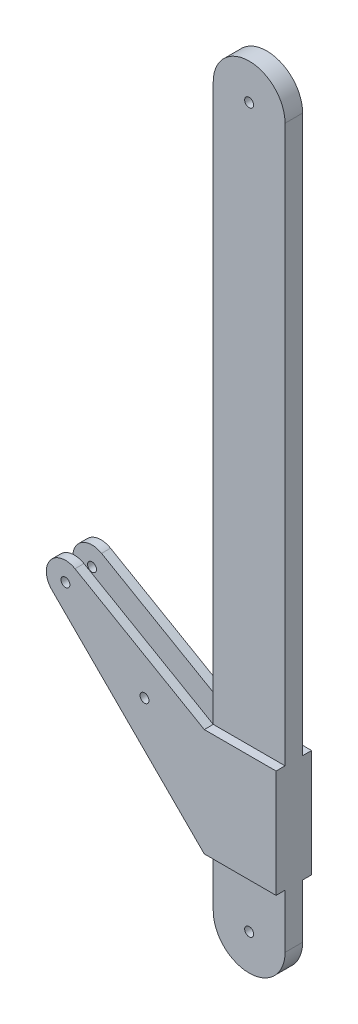
ISO-10303-21;
HEADER;
FILE_DESCRIPTION(('STEP AP214'),'2;1');
FILE_NAME('part.step','',(''),(''),'','','');
FILE_SCHEMA(('AUTOMOTIVE_DESIGN { 1 0 10303 214 1 1 1 1 }'));
ENDSEC;
DATA;
#1=APPLICATION_CONTEXT('core data for automotive mechanical design processes');
#2=APPLICATION_PROTOCOL_DEFINITION('international standard','automotive_design',2000,#1);
#3=PRODUCT_CONTEXT('',#1,'mechanical');
#4=PRODUCT('Part','Part','',(#3));
#5=PRODUCT_RELATED_PRODUCT_CATEGORY('part','',(#4));
#6=PRODUCT_DEFINITION_FORMATION('','',#4);
#7=PRODUCT_DEFINITION_CONTEXT('part definition',#1,'design');
#8=PRODUCT_DEFINITION('design','',#6,#7);
#9=PRODUCT_DEFINITION_SHAPE('','',#8);
#10=(LENGTH_UNIT() NAMED_UNIT(*) SI_UNIT(.MILLI.,.METRE.));
#11=(NAMED_UNIT(*) PLANE_ANGLE_UNIT() SI_UNIT($,.RADIAN.));
#12=(NAMED_UNIT(*) SI_UNIT($,.STERADIAN.) SOLID_ANGLE_UNIT());
#13=UNCERTAINTY_MEASURE_WITH_UNIT(LENGTH_MEASURE(1.E-05),#10,'distance_accuracy_value','');
#14=(GEOMETRIC_REPRESENTATION_CONTEXT(3) GLOBAL_UNCERTAINTY_ASSIGNED_CONTEXT((#13)) GLOBAL_UNIT_ASSIGNED_CONTEXT((#10,
#11,#12)) REPRESENTATION_CONTEXT('',''));
#15=CARTESIAN_POINT('',(0.,0.,0.));
#16=DIRECTION('',(0.,0.,1.));
#17=DIRECTION('',(1.,0.,0.));
#18=AXIS2_PLACEMENT_3D('',#15,#16,#17);
#19=CARTESIAN_POINT('',(0.,0.,-2.45));
#20=DIRECTION('',(0.,0.,1.));
#21=DIRECTION('',(1.,0.,0.));
#22=AXIS2_PLACEMENT_3D('',#19,#20,#21);
#23=PLANE('',#22);
#24=CARTESIAN_POINT('',(0.,-100.,-2.45));
#25=DIRECTION('',(0.,0.,1.));
#26=DIRECTION('',(1.,0.,0.));
#27=AXIS2_PLACEMENT_3D('',#24,#25,#26);
#28=CIRCLE('',#27,1.25);
#29=CARTESIAN_POINT('',(1.25000000000003,-100.,-2.45));
#30=VERTEX_POINT('',#29);
#31=EDGE_CURVE('E283',#30,#30,#28,.T.);
#32=ORIENTED_EDGE('',*,*,#31,.T.);
#33=EDGE_LOOP('',(#32));
#34=FACE_BOUND('',#33,.T.);
#35=DIRECTION('',(0.,1.,0.));
#36=VECTOR('',#35,1.);
#37=CARTESIAN_POINT('',(-9.99999999999999,0.,-2.45));
#38=LINE('',#37,#36);
#39=CARTESIAN_POINT('',(-9.99999999999999,-100.,-2.45));
#40=VERTEX_POINT('',#39);
#41=CARTESIAN_POINT('',(-9.99999999999999,-85.0000000000001,-2.45));
#42=VERTEX_POINT('',#41);
#43=EDGE_CURVE('E287',#40,#42,#38,.T.);
#44=ORIENTED_EDGE('',*,*,#43,.T.);
#45=DIRECTION('',(1.,0.,0.));
#46=VECTOR('',#45,1.);
#47=CARTESIAN_POINT('',(10.,-85.0000000000001,-2.45));
#48=LINE('',#47,#46);
#49=CARTESIAN_POINT('',(10.,-85.0000000000001,-2.45));
#50=VERTEX_POINT('',#49);
#51=EDGE_CURVE('E154',#42,#50,#48,.T.);
#52=ORIENTED_EDGE('',*,*,#51,.T.);
#53=DIRECTION('',(0.,1.,0.));
#54=VECTOR('',#53,1.);
#55=CARTESIAN_POINT('',(10.,0.,-2.45));
#56=LINE('',#55,#54);
#57=CARTESIAN_POINT('',(10.,-100.,-2.45));
#58=VERTEX_POINT('',#57);
#59=EDGE_CURVE('E295',#58,#50,#56,.T.);
#60=ORIENTED_EDGE('',*,*,#59,.F.);
#61=CARTESIAN_POINT('',(0.,-100.,-2.45));
#62=DIRECTION('',(0.,0.,1.));
#63=DIRECTION('',(1.,0.,0.));
#64=AXIS2_PLACEMENT_3D('',#61,#62,#63);
#65=CIRCLE('',#64,10.);
#66=EDGE_CURVE('E290',#40,#58,#65,.T.);
#67=ORIENTED_EDGE('',*,*,#66,.F.);
#68=EDGE_LOOP('',(#44,#52,#60,#67));
#69=FACE_BOUND('',#68,.T.);
#70=ADVANCED_FACE('F35',(#34,#69),#23,.F.);
#71=CARTESIAN_POINT('',(0.,0.,2.45));
#72=DIRECTION('',(0.,0.,1.));
#73=DIRECTION('',(1.,0.,0.));
#74=AXIS2_PLACEMENT_3D('',#71,#72,#73);
#75=PLANE('',#74);
#76=DIRECTION('',(1.,0.,0.));
#77=VECTOR('',#76,1.);
#78=CARTESIAN_POINT('',(10.,-85.0000000000001,2.45));
#79=LINE('',#78,#77);
#80=CARTESIAN_POINT('',(-9.99999999999999,-85.0000000000001,2.45));
#81=VERTEX_POINT('',#80);
#82=CARTESIAN_POINT('',(10.,-85.0000000000001,2.45));
#83=VERTEX_POINT('',#82);
#84=EDGE_CURVE('E214',#81,#83,#79,.T.);
#85=ORIENTED_EDGE('',*,*,#84,.F.);
#86=DIRECTION('',(0.,1.,0.));
#87=VECTOR('',#86,1.);
#88=CARTESIAN_POINT('',(-9.99999999999999,0.,2.45));
#89=LINE('',#88,#87);
#90=CARTESIAN_POINT('',(-9.99999999999999,-100.,2.45));
#91=VERTEX_POINT('',#90);
#92=EDGE_CURVE('E267',#91,#81,#89,.T.);
#93=ORIENTED_EDGE('',*,*,#92,.F.);
#94=CARTESIAN_POINT('',(0.,-100.,2.45));
#95=DIRECTION('',(0.,0.,1.));
#96=DIRECTION('',(1.,0.,0.));
#97=AXIS2_PLACEMENT_3D('',#94,#95,#96);
#98=CIRCLE('',#97,10.);
#99=CARTESIAN_POINT('',(10.,-100.,2.45));
#100=VERTEX_POINT('',#99);
#101=EDGE_CURVE('E270',#91,#100,#98,.T.);
#102=ORIENTED_EDGE('',*,*,#101,.T.);
#103=DIRECTION('',(0.,1.,0.));
#104=VECTOR('',#103,1.);
#105=CARTESIAN_POINT('',(10.,0.,2.45));
#106=LINE('',#105,#104);
#107=EDGE_CURVE('E275',#100,#83,#106,.T.);
#108=ORIENTED_EDGE('',*,*,#107,.T.);
#109=EDGE_LOOP('',(#85,#93,#102,#108));
#110=FACE_BOUND('',#109,.T.);
#111=CARTESIAN_POINT('',(0.,-100.,2.45));
#112=DIRECTION('',(0.,0.,1.));
#113=DIRECTION('',(1.,0.,0.));
#114=AXIS2_PLACEMENT_3D('',#111,#112,#113);
#115=CIRCLE('',#114,1.25);
#116=CARTESIAN_POINT('',(1.25000000000003,-100.,2.45));
#117=VERTEX_POINT('',#116);
#118=EDGE_CURVE('E262',#117,#117,#115,.T.);
#119=ORIENTED_EDGE('',*,*,#118,.F.);
#120=EDGE_LOOP('',(#119));
#121=FACE_BOUND('',#120,.T.);
#122=ADVANCED_FACE('F356',(#110,#121),#75,.T.);
#123=CARTESIAN_POINT('',(-9.99999999999999,0.,2.45));
#124=DIRECTION('',(-1.,0.,0.));
#125=DIRECTION('',(0.,-1.,0.));
#126=AXIS2_PLACEMENT_3D('',#123,#124,#125);
#127=PLANE('',#126);
#128=ORIENTED_EDGE('',*,*,#43,.F.);
#129=DIRECTION('',(0.,0.,-1.));
#130=VECTOR('',#129,1.);
#131=CARTESIAN_POINT('',(-9.99999999999999,-100.,2.45));
#132=LINE('',#131,#130);
#133=EDGE_CURVE('E11',#91,#40,#132,.T.);
#134=ORIENTED_EDGE('',*,*,#133,.F.);
#135=ORIENTED_EDGE('',*,*,#92,.T.);
#136=CARTESIAN_POINT('',(-9.99999999999999,-55.0000000000001,2.45));
#137=VERTEX_POINT('',#136);
#138=EDGE_CURVE('E271',#81,#137,#89,.T.);
#139=ORIENTED_EDGE('',*,*,#138,.T.);
#140=CARTESIAN_POINT('',(-9.99999999999999,99.9999999999999,2.45));
#141=VERTEX_POINT('',#140);
#142=EDGE_CURVE('E266',#137,#141,#89,.T.);
#143=ORIENTED_EDGE('',*,*,#142,.T.);
#144=DIRECTION('',(0.,0.,-1.));
#145=VECTOR('',#144,1.);
#146=CARTESIAN_POINT('',(-9.99999999999999,99.9999999999999,2.45));
#147=LINE('',#146,#145);
#148=CARTESIAN_POINT('',(-9.99999999999999,99.9999999999999,-2.45));
#149=VERTEX_POINT('',#148);
#150=EDGE_CURVE('E280',#141,#149,#147,.T.);
#151=ORIENTED_EDGE('',*,*,#150,.T.);
#152=CARTESIAN_POINT('',(-9.99999999999999,-55.0000000000001,-2.45));
#153=VERTEX_POINT('',#152);
#154=EDGE_CURVE('E286',#153,#149,#38,.T.);
#155=ORIENTED_EDGE('',*,*,#154,.F.);
#156=EDGE_CURVE('E291',#42,#153,#38,.T.);
#157=ORIENTED_EDGE('',*,*,#156,.F.);
#158=EDGE_LOOP('',(#128,#134,#135,#139,#143,#151,#155,#157));
#159=FACE_BOUND('',#158,.T.);
#160=ADVANCED_FACE('F316',(#159),#127,.T.);
#161=CARTESIAN_POINT('',(0.,-100.,2.45));
#162=DIRECTION('',(0.,0.,-1.));
#163=DIRECTION('',(-1.,0.,0.));
#164=AXIS2_PLACEMENT_3D('',#161,#162,#163);
#165=CYLINDRICAL_SURFACE('',#164,10.);
#166=ORIENTED_EDGE('',*,*,#66,.T.);
#167=DIRECTION('',(0.,0.,-1.));
#168=VECTOR('',#167,1.);
#169=CARTESIAN_POINT('',(10.,-100.,2.45));
#170=LINE('',#169,#168);
#171=EDGE_CURVE('E43',#100,#58,#170,.T.);
#172=ORIENTED_EDGE('',*,*,#171,.F.);
#173=ORIENTED_EDGE('',*,*,#101,.F.);
#174=ORIENTED_EDGE('',*,*,#133,.T.);
#175=EDGE_LOOP('',(#166,#172,#173,#174));
#176=FACE_BOUND('',#175,.T.);
#177=ADVANCED_FACE('F311',(#176),#165,.T.);
#178=CARTESIAN_POINT('',(10.,0.,2.45));
#179=DIRECTION('',(-1.,0.,0.));
#180=DIRECTION('',(0.,-1.,0.));
#181=AXIS2_PLACEMENT_3D('',#178,#179,#180);
#182=PLANE('',#181);
#183=ORIENTED_EDGE('',*,*,#59,.T.);
#184=DIRECTION('',(0.,0.,1.));
#185=VECTOR('',#184,1.);
#186=CARTESIAN_POINT('',(10.,-85.0000000000001,-4.95));
#187=LINE('',#186,#185);
#188=CARTESIAN_POINT('',(10.,-85.0000000000001,-4.95));
#189=VERTEX_POINT('',#188);
#190=EDGE_CURVE('E186',#189,#50,#187,.T.);
#191=ORIENTED_EDGE('',*,*,#190,.F.);
#192=DIRECTION('',(0.,1.,0.));
#193=VECTOR('',#192,1.);
#194=CARTESIAN_POINT('',(10.,-55.0000000000001,-4.95));
#195=LINE('',#194,#193);
#196=CARTESIAN_POINT('',(10.,-55.0000000000001,-4.95));
#197=VERTEX_POINT('',#196);
#198=EDGE_CURVE('E170',#189,#197,#195,.T.);
#199=ORIENTED_EDGE('',*,*,#198,.T.);
#200=DIRECTION('',(0.,0.,1.));
#201=VECTOR('',#200,1.);
#202=CARTESIAN_POINT('',(10.,-55.0000000000001,-4.95));
#203=LINE('',#202,#201);
#204=CARTESIAN_POINT('',(10.,-55.0000000000001,-2.45));
#205=VERTEX_POINT('',#204);
#206=EDGE_CURVE('E198',#197,#205,#203,.T.);
#207=ORIENTED_EDGE('',*,*,#206,.T.);
#208=CARTESIAN_POINT('',(10.,100.,-2.45));
#209=VERTEX_POINT('',#208);
#210=EDGE_CURVE('E294',#205,#209,#56,.T.);
#211=ORIENTED_EDGE('',*,*,#210,.T.);
#212=DIRECTION('',(0.,0.,-1.));
#213=VECTOR('',#212,1.);
#214=CARTESIAN_POINT('',(10.,100.,2.45));
#215=LINE('',#214,#213);
#216=CARTESIAN_POINT('',(10.,100.,2.45));
#217=VERTEX_POINT('',#216);
#218=EDGE_CURVE('E302',#217,#209,#215,.T.);
#219=ORIENTED_EDGE('',*,*,#218,.F.);
#220=CARTESIAN_POINT('',(10.,-55.0000000000001,2.45));
#221=VERTEX_POINT('',#220);
#222=EDGE_CURVE('E274',#221,#217,#106,.T.);
#223=ORIENTED_EDGE('',*,*,#222,.F.);
#224=DIRECTION('',(0.,0.,-1.));
#225=VECTOR('',#224,1.);
#226=CARTESIAN_POINT('',(10.,-55.0000000000001,4.95));
#227=LINE('',#226,#225);
#228=CARTESIAN_POINT('',(10.,-55.0000000000001,4.95));
#229=VERTEX_POINT('',#228);
#230=EDGE_CURVE('E252',#229,#221,#227,.T.);
#231=ORIENTED_EDGE('',*,*,#230,.F.);
#232=DIRECTION('',(0.,1.,0.));
#233=VECTOR('',#232,1.);
#234=CARTESIAN_POINT('',(10.,-55.0000000000001,4.95));
#235=LINE('',#234,#233);
#236=CARTESIAN_POINT('',(10.,-85.0000000000001,4.95));
#237=VERTEX_POINT('',#236);
#238=EDGE_CURVE('E220',#237,#229,#235,.T.);
#239=ORIENTED_EDGE('',*,*,#238,.F.);
#240=DIRECTION('',(0.,0.,-1.));
#241=VECTOR('',#240,1.);
#242=CARTESIAN_POINT('',(10.,-85.0000000000001,4.95));
#243=LINE('',#242,#241);
#244=EDGE_CURVE('E255',#237,#83,#243,.T.);
#245=ORIENTED_EDGE('',*,*,#244,.T.);
#246=ORIENTED_EDGE('',*,*,#107,.F.);
#247=ORIENTED_EDGE('',*,*,#171,.T.);
#248=EDGE_LOOP('',(#183,#191,#199,#207,#211,#219,#223,#231,#239,#245,#246,#247));
#249=FACE_BOUND('',#248,.T.);
#250=ADVANCED_FACE('F307',(#249),#182,.F.);
#251=CARTESIAN_POINT('',(0.,-100.,2.45));
#252=DIRECTION('',(0.,0.,-1.));
#253=DIRECTION('',(-1.,0.,0.));
#254=AXIS2_PLACEMENT_3D('',#251,#252,#253);
#255=CYLINDRICAL_SURFACE('',#254,1.25);
#256=ORIENTED_EDGE('',*,*,#118,.T.);
#257=EDGE_LOOP('',(#256));
#258=FACE_BOUND('',#257,.T.);
#259=ORIENTED_EDGE('',*,*,#31,.F.);
#260=EDGE_LOOP('',(#259));
#261=FACE_BOUND('',#260,.T.);
#262=ADVANCED_FACE('F379',(#258,#261),#255,.F.);
#263=CARTESIAN_POINT('',(0.,100.,2.45));
#264=DIRECTION('',(0.,0.,-1.));
#265=DIRECTION('',(-1.,0.,0.));
#266=AXIS2_PLACEMENT_3D('',#263,#264,#265);
#267=CYLINDRICAL_SURFACE('',#266,1.25);
#268=CARTESIAN_POINT('',(0.,100.,2.45));
#269=DIRECTION('',(0.,0.,1.));
#270=DIRECTION('',(1.,0.,0.));
#271=AXIS2_PLACEMENT_3D('',#268,#269,#270);
#272=CIRCLE('',#271,1.25);
#273=CARTESIAN_POINT('',(1.25000000000001,100.,2.45));
#274=VERTEX_POINT('',#273);
#275=EDGE_CURVE('E259',#274,#274,#272,.T.);
#276=ORIENTED_EDGE('',*,*,#275,.T.);
#277=EDGE_LOOP('',(#276));
#278=FACE_BOUND('',#277,.T.);
#279=CARTESIAN_POINT('',(0.,100.,-2.45));
#280=DIRECTION('',(0.,0.,1.));
#281=DIRECTION('',(1.,0.,0.));
#282=AXIS2_PLACEMENT_3D('',#279,#280,#281);
#283=CIRCLE('',#282,1.25);
#284=CARTESIAN_POINT('',(1.25000000000001,100.,-2.45));
#285=VERTEX_POINT('',#284);
#286=EDGE_CURVE('E258',#285,#285,#283,.T.);
#287=ORIENTED_EDGE('',*,*,#286,.F.);
#288=EDGE_LOOP('',(#287));
#289=FACE_BOUND('',#288,.T.);
#290=ADVANCED_FACE('F37',(#278,#289),#267,.F.);
#291=CARTESIAN_POINT('',(0.,100.,2.45));
#292=DIRECTION('',(0.,0.,-1.));
#293=DIRECTION('',(-1.,0.,0.));
#294=AXIS2_PLACEMENT_3D('',#291,#292,#293);
#295=CYLINDRICAL_SURFACE('',#294,10.);
#296=CARTESIAN_POINT('',(0.,100.,-2.45));
#297=DIRECTION('',(0.,0.,1.));
#298=DIRECTION('',(1.,0.,0.));
#299=AXIS2_PLACEMENT_3D('',#296,#297,#298);
#300=CIRCLE('',#299,10.);
#301=EDGE_CURVE('E263',#209,#149,#300,.T.);
#302=ORIENTED_EDGE('',*,*,#301,.T.);
#303=ORIENTED_EDGE('',*,*,#150,.F.);
#304=CARTESIAN_POINT('',(0.,100.,2.45));
#305=DIRECTION('',(0.,0.,1.));
#306=DIRECTION('',(1.,0.,0.));
#307=AXIS2_PLACEMENT_3D('',#304,#305,#306);
#308=CIRCLE('',#307,10.);
#309=EDGE_CURVE('E277',#217,#141,#308,.T.);
#310=ORIENTED_EDGE('',*,*,#309,.F.);
#311=ORIENTED_EDGE('',*,*,#218,.T.);
#312=EDGE_LOOP('',(#302,#303,#310,#311));
#313=FACE_BOUND('',#312,.T.);
#314=ADVANCED_FACE('F328',(#313),#295,.T.);
#315=DIRECTION('',(-1.,0.,0.));
#316=VECTOR('',#315,1.);
#317=CARTESIAN_POINT('',(-9.99999999999999,-55.0000000000001,2.45));
#318=LINE('',#317,#316);
#319=EDGE_CURVE('E58',#221,#137,#318,.T.);
#320=ORIENTED_EDGE('',*,*,#319,.F.);
#321=ORIENTED_EDGE('',*,*,#222,.T.);
#322=ORIENTED_EDGE('',*,*,#309,.T.);
#323=ORIENTED_EDGE('',*,*,#142,.F.);
#324=EDGE_LOOP('',(#320,#321,#322,#323));
#325=FACE_BOUND('',#324,.T.);
#326=ORIENTED_EDGE('',*,*,#275,.F.);
#327=EDGE_LOOP('',(#326));
#328=FACE_BOUND('',#327,.T.);
#329=ADVANCED_FACE('F364',(#325,#328),#75,.T.);
#330=ORIENTED_EDGE('',*,*,#286,.T.);
#331=EDGE_LOOP('',(#330));
#332=FACE_BOUND('',#331,.T.);
#333=ORIENTED_EDGE('',*,*,#210,.F.);
#334=DIRECTION('',(-1.,0.,0.));
#335=VECTOR('',#334,1.);
#336=CARTESIAN_POINT('',(-9.99999999999999,-55.0000000000001,-2.45));
#337=LINE('',#336,#335);
#338=EDGE_CURVE('E171',#205,#153,#337,.T.);
#339=ORIENTED_EDGE('',*,*,#338,.T.);
#340=ORIENTED_EDGE('',*,*,#154,.T.);
#341=ORIENTED_EDGE('',*,*,#301,.F.);
#342=EDGE_LOOP('',(#333,#339,#340,#341));
#343=FACE_BOUND('',#342,.T.);
#344=ADVANCED_FACE('F323',(#332,#343),#23,.F.);
#345=CARTESIAN_POINT('',(-48.667154686541,-38.8143409441554,4.95));
#346=DIRECTION('',(0.,0.,1.));
#347=DIRECTION('',(1.,0.,0.));
#348=AXIS2_PLACEMENT_3D('',#345,#346,#347);
#349=PLANE('',#348);
#350=CARTESIAN_POINT('',(-48.667154686541,-38.8143409441554,4.95));
#351=DIRECTION('',(0.,0.,1.));
#352=DIRECTION('',(1.,0.,0.));
#353=AXIS2_PLACEMENT_3D('',#350,#351,#352);
#354=CIRCLE('',#353,1.25);
#355=CARTESIAN_POINT('',(-47.417154686541,-38.8143409441554,4.95));
#356=VERTEX_POINT('',#355);
#357=EDGE_CURVE('E211',#356,#356,#354,.T.);
#358=ORIENTED_EDGE('',*,*,#357,.F.);
#359=EDGE_LOOP('',(#358));
#360=FACE_BOUND('',#359,.T.);
#361=DIRECTION('',(1.,0.,0.));
#362=VECTOR('',#361,1.);
#363=CARTESIAN_POINT('',(10.,-85.0000000000001,4.95));
#364=LINE('',#363,#362);
#365=CARTESIAN_POINT('',(-9.99999999999999,-85.0000000000001,4.95));
#366=VERTEX_POINT('',#365);
#367=EDGE_CURVE('E217',#366,#237,#364,.T.);
#368=ORIENTED_EDGE('',*,*,#367,.T.);
#369=ORIENTED_EDGE('',*,*,#238,.T.);
#370=DIRECTION('',(-1.,0.,0.));
#371=VECTOR('',#370,1.);
#372=CARTESIAN_POINT('',(-9.99999999999999,-55.0000000000001,4.95));
#373=LINE('',#372,#371);
#374=CARTESIAN_POINT('',(-9.99999999999999,-55.0000000000001,4.95));
#375=VERTEX_POINT('',#374);
#376=EDGE_CURVE('E223',#229,#375,#373,.T.);
#377=ORIENTED_EDGE('',*,*,#376,.T.);
#378=DIRECTION('',(-0.866025403784436,0.500000000000004,0.));
#379=VECTOR('',#378,1.);
#380=CARTESIAN_POINT('',(-46.0089619745832,-34.2102161107353,4.95));
#381=LINE('',#380,#379);
#382=CARTESIAN_POINT('',(-46.0089619745832,-34.2102161107353,4.95));
#383=VERTEX_POINT('',#382);
#384=EDGE_CURVE('E225',#375,#383,#381,.T.);
#385=ORIENTED_EDGE('',*,*,#384,.T.);
#386=CARTESIAN_POINT('',(-48.667154686541,-38.8143409441554,4.95));
#387=DIRECTION('',(0.,0.,1.));
#388=DIRECTION('',(1.,0.,0.));
#389=AXIS2_PLACEMENT_3D('',#386,#387,#388);
#390=CIRCLE('',#389,5.31638542391549);
#391=CARTESIAN_POINT('',(-52.4264068711929,-42.5735931288073,4.95));
#392=VERTEX_POINT('',#391);
#393=EDGE_CURVE('E227',#383,#392,#390,.T.);
#394=ORIENTED_EDGE('',*,*,#393,.T.);
#395=DIRECTION('',(0.707106781186549,-0.707106781186546,0.));
#396=VECTOR('',#395,1.);
#397=CARTESIAN_POINT('',(-9.99999999999999,-85.0000000000001,4.95));
#398=LINE('',#397,#396);
#399=EDGE_CURVE('E229',#392,#366,#398,.T.);
#400=ORIENTED_EDGE('',*,*,#399,.T.);
#401=EDGE_LOOP('',(#368,#369,#377,#385,#394,#400));
#402=FACE_BOUND('',#401,.T.);
#403=CARTESIAN_POINT('',(-26.6456317226744,-55.7120498307287,4.95));
#404=DIRECTION('',(0.,0.,1.));
#405=DIRECTION('',(1.,0.,0.));
#406=AXIS2_PLACEMENT_3D('',#403,#404,#405);
#407=CIRCLE('',#406,1.25);
#408=CARTESIAN_POINT('',(-25.3956317226744,-55.7120498307287,4.95));
#409=VERTEX_POINT('',#408);
#410=EDGE_CURVE('E205',#409,#409,#407,.T.);
#411=ORIENTED_EDGE('',*,*,#410,.F.);
#412=EDGE_LOOP('',(#411));
#413=FACE_BOUND('',#412,.T.);
#414=ADVANCED_FACE('F367',(#360,#402,#413),#349,.T.);
#415=CARTESIAN_POINT('',(-48.667154686541,-38.8143409441554,2.45));
#416=DIRECTION('',(0.,0.,1.));
#417=DIRECTION('',(1.,0.,0.));
#418=AXIS2_PLACEMENT_3D('',#415,#416,#417);
#419=PLANE('',#418);
#420=ORIENTED_EDGE('',*,*,#138,.F.);
#421=DIRECTION('',(0.707106781186549,-0.707106781186546,0.));
#422=VECTOR('',#421,1.);
#423=CARTESIAN_POINT('',(-9.99999999999999,-85.0000000000001,2.45));
#424=LINE('',#423,#422);
#425=CARTESIAN_POINT('',(-52.4264068711929,-42.5735931288073,2.45));
#426=VERTEX_POINT('',#425);
#427=EDGE_CURVE('E221',#426,#81,#424,.T.);
#428=ORIENTED_EDGE('',*,*,#427,.F.);
#429=CARTESIAN_POINT('',(-48.667154686541,-38.8143409441554,2.45));
#430=DIRECTION('',(0.,0.,1.));
#431=DIRECTION('',(1.,0.,0.));
#432=AXIS2_PLACEMENT_3D('',#429,#430,#431);
#433=CIRCLE('',#432,5.31638542391549);
#434=CARTESIAN_POINT('',(-46.0089619745832,-34.2102161107353,2.45));
#435=VERTEX_POINT('',#434);
#436=EDGE_CURVE('E237',#435,#426,#433,.T.);
#437=ORIENTED_EDGE('',*,*,#436,.F.);
#438=DIRECTION('',(-0.866025403784436,0.500000000000004,0.));
#439=VECTOR('',#438,1.);
#440=CARTESIAN_POINT('',(-46.0089619745832,-34.2102161107353,2.45));
#441=LINE('',#440,#439);
#442=EDGE_CURVE('E235',#137,#435,#441,.T.);
#443=ORIENTED_EDGE('',*,*,#442,.F.);
#444=EDGE_LOOP('',(#420,#428,#437,#443));
#445=FACE_BOUND('',#444,.T.);
#446=CARTESIAN_POINT('',(-48.667154686541,-38.8143409441554,2.45));
#447=DIRECTION('',(0.,0.,1.));
#448=DIRECTION('',(1.,0.,0.));
#449=AXIS2_PLACEMENT_3D('',#446,#447,#448);
#450=CIRCLE('',#449,1.25);
#451=CARTESIAN_POINT('',(-47.417154686541,-38.8143409441554,2.45));
#452=VERTEX_POINT('',#451);
#453=EDGE_CURVE('E208',#452,#452,#450,.T.);
#454=ORIENTED_EDGE('',*,*,#453,.T.);
#455=EDGE_LOOP('',(#454));
#456=FACE_BOUND('',#455,.T.);
#457=CARTESIAN_POINT('',(-26.6456317226744,-55.7120498307287,2.45));
#458=DIRECTION('',(0.,0.,1.));
#459=DIRECTION('',(1.,0.,0.));
#460=AXIS2_PLACEMENT_3D('',#457,#458,#459);
#461=CIRCLE('',#460,1.25);
#462=CARTESIAN_POINT('',(-25.3956317226744,-55.7120498307287,2.45));
#463=VERTEX_POINT('',#462);
#464=EDGE_CURVE('E159',#463,#463,#461,.T.);
#465=ORIENTED_EDGE('',*,*,#464,.T.);
#466=EDGE_LOOP('',(#465));
#467=FACE_BOUND('',#466,.T.);
#468=ADVANCED_FACE('F373',(#445,#456,#467),#419,.F.);
#469=CARTESIAN_POINT('',(10.,-85.0000000000001,4.95));
#470=DIRECTION('',(0.,1.,0.));
#471=DIRECTION('',(0.,0.,1.));
#472=AXIS2_PLACEMENT_3D('',#469,#470,#471);
#473=PLANE('',#472);
#474=ORIENTED_EDGE('',*,*,#84,.T.);
#475=ORIENTED_EDGE('',*,*,#244,.F.);
#476=ORIENTED_EDGE('',*,*,#367,.F.);
#477=DIRECTION('',(0.,0.,-1.));
#478=VECTOR('',#477,1.);
#479=CARTESIAN_POINT('',(-9.99999999999999,-85.0000000000001,4.95));
#480=LINE('',#479,#478);
#481=EDGE_CURVE('E231',#366,#81,#480,.T.);
#482=ORIENTED_EDGE('',*,*,#481,.T.);
#483=EDGE_LOOP('',(#474,#475,#476,#482));
#484=FACE_BOUND('',#483,.T.);
#485=ADVANCED_FACE('F511',(#484),#473,.F.);
#486=CARTESIAN_POINT('',(-9.99999999999999,-55.0000000000001,4.95));
#487=DIRECTION('',(0.,-1.,0.));
#488=DIRECTION('',(0.,0.,-1.));
#489=AXIS2_PLACEMENT_3D('',#486,#487,#488);
#490=PLANE('',#489);
#491=ORIENTED_EDGE('',*,*,#319,.T.);
#492=DIRECTION('',(0.,0.,-1.));
#493=VECTOR('',#492,1.);
#494=CARTESIAN_POINT('',(-9.99999999999999,-55.0000000000001,4.95));
#495=LINE('',#494,#493);
#496=EDGE_CURVE('E249',#375,#137,#495,.T.);
#497=ORIENTED_EDGE('',*,*,#496,.F.);
#498=ORIENTED_EDGE('',*,*,#376,.F.);
#499=ORIENTED_EDGE('',*,*,#230,.T.);
#500=EDGE_LOOP('',(#491,#497,#498,#499));
#501=FACE_BOUND('',#500,.T.);
#502=ADVANCED_FACE('F523',(#501),#490,.F.);
#503=CARTESIAN_POINT('',(-46.0089619745832,-34.2102161107353,4.95));
#504=DIRECTION('',(-0.500000000000004,-0.866025403784436,0.));
#505=DIRECTION('',(0.866025403784436,-0.500000000000004,0.));
#506=AXIS2_PLACEMENT_3D('',#503,#504,#505);
#507=PLANE('',#506);
#508=ORIENTED_EDGE('',*,*,#442,.T.);
#509=DIRECTION('',(0.,0.,-1.));
#510=VECTOR('',#509,1.);
#511=CARTESIAN_POINT('',(-46.0089619745832,-34.2102161107353,4.95));
#512=LINE('',#511,#510);
#513=EDGE_CURVE('E246',#383,#435,#512,.T.);
#514=ORIENTED_EDGE('',*,*,#513,.F.);
#515=ORIENTED_EDGE('',*,*,#384,.F.);
#516=ORIENTED_EDGE('',*,*,#496,.T.);
#517=EDGE_LOOP('',(#508,#514,#515,#516));
#518=FACE_BOUND('',#517,.T.);
#519=ADVANCED_FACE('F519',(#518),#507,.F.);
#520=CARTESIAN_POINT('',(-48.667154686541,-38.8143409441554,4.95));
#521=DIRECTION('',(0.,0.,-1.));
#522=DIRECTION('',(-1.,0.,0.));
#523=AXIS2_PLACEMENT_3D('',#520,#521,#522);
#524=CYLINDRICAL_SURFACE('',#523,5.31638542391549);
#525=ORIENTED_EDGE('',*,*,#436,.T.);
#526=DIRECTION('',(0.,0.,-1.));
#527=VECTOR('',#526,1.);
#528=CARTESIAN_POINT('',(-52.4264068711929,-42.5735931288073,4.95));
#529=LINE('',#528,#527);
#530=EDGE_CURVE('E243',#392,#426,#529,.T.);
#531=ORIENTED_EDGE('',*,*,#530,.F.);
#532=ORIENTED_EDGE('',*,*,#393,.F.);
#533=ORIENTED_EDGE('',*,*,#513,.T.);
#534=EDGE_LOOP('',(#525,#531,#532,#533));
#535=FACE_BOUND('',#534,.T.);
#536=ADVANCED_FACE('F515',(#535),#524,.T.);
#537=CARTESIAN_POINT('',(-9.99999999999999,-85.0000000000001,4.95));
#538=DIRECTION('',(0.707106781186546,0.707106781186549,0.));
#539=DIRECTION('',(-0.707106781186549,0.707106781186546,0.));
#540=AXIS2_PLACEMENT_3D('',#537,#538,#539);
#541=PLANE('',#540);
#542=ORIENTED_EDGE('',*,*,#427,.T.);
#543=ORIENTED_EDGE('',*,*,#481,.F.);
#544=ORIENTED_EDGE('',*,*,#399,.F.);
#545=ORIENTED_EDGE('',*,*,#530,.T.);
#546=EDGE_LOOP('',(#542,#543,#544,#545));
#547=FACE_BOUND('',#546,.T.);
#548=ADVANCED_FACE('F506',(#547),#541,.F.);
#549=CARTESIAN_POINT('',(-48.667154686541,-38.8143409441554,4.95));
#550=DIRECTION('',(0.,0.,-1.));
#551=DIRECTION('',(-1.,0.,0.));
#552=AXIS2_PLACEMENT_3D('',#549,#550,#551);
#553=CYLINDRICAL_SURFACE('',#552,1.25);
#554=ORIENTED_EDGE('',*,*,#357,.T.);
#555=EDGE_LOOP('',(#554));
#556=FACE_BOUND('',#555,.T.);
#557=ORIENTED_EDGE('',*,*,#453,.F.);
#558=EDGE_LOOP('',(#557));
#559=FACE_BOUND('',#558,.T.);
#560=ADVANCED_FACE('F348',(#556,#559),#553,.F.);
#561=CARTESIAN_POINT('',(-26.6456317226744,-55.7120498307287,4.95));
#562=DIRECTION('',(0.,0.,-1.));
#563=DIRECTION('',(-1.,0.,0.));
#564=AXIS2_PLACEMENT_3D('',#561,#562,#563);
#565=CYLINDRICAL_SURFACE('',#564,1.25);
#566=ORIENTED_EDGE('',*,*,#410,.T.);
#567=EDGE_LOOP('',(#566));
#568=FACE_BOUND('',#567,.T.);
#569=ORIENTED_EDGE('',*,*,#464,.F.);
#570=EDGE_LOOP('',(#569));
#571=FACE_BOUND('',#570,.T.);
#572=ADVANCED_FACE('F340',(#568,#571),#565,.F.);
#573=CARTESIAN_POINT('',(-48.667154686541,-38.8143409441554,-2.45));
#574=DIRECTION('',(0.,0.,-1.));
#575=DIRECTION('',(1.,0.,0.));
#576=AXIS2_PLACEMENT_3D('',#573,#574,#575);
#577=PLANE('',#576);
#578=CARTESIAN_POINT('',(-26.6456317226744,-55.7120498307287,-2.45));
#579=DIRECTION('',(0.,0.,1.));
#580=DIRECTION('',(1.,0.,0.));
#581=AXIS2_PLACEMENT_3D('',#578,#579,#580);
#582=CIRCLE('',#581,1.25);
#583=CARTESIAN_POINT('',(-25.3956317226744,-55.7120498307287,-2.45));
#584=VERTEX_POINT('',#583);
#585=EDGE_CURVE('E493',#584,#584,#582,.T.);
#586=ORIENTED_EDGE('',*,*,#585,.F.);
#587=EDGE_LOOP('',(#586));
#588=FACE_BOUND('',#587,.T.);
#589=CARTESIAN_POINT('',(-48.667154686541,-38.8143409441554,-2.45));
#590=DIRECTION('',(0.,0.,1.));
#591=DIRECTION('',(1.,0.,0.));
#592=AXIS2_PLACEMENT_3D('',#589,#590,#591);
#593=CIRCLE('',#592,1.25);
#594=CARTESIAN_POINT('',(-47.417154686541,-38.8143409441554,-2.45));
#595=VERTEX_POINT('',#594);
#596=EDGE_CURVE('E495',#595,#595,#593,.T.);
#597=ORIENTED_EDGE('',*,*,#596,.F.);
#598=EDGE_LOOP('',(#597));
#599=FACE_BOUND('',#598,.T.);
#600=DIRECTION('',(0.707106781186549,-0.707106781186546,0.));
#601=VECTOR('',#600,1.);
#602=CARTESIAN_POINT('',(-9.99999999999999,-85.0000000000001,-2.45));
#603=LINE('',#602,#601);
#604=CARTESIAN_POINT('',(-52.4264068711929,-42.5735931288073,-2.45));
#605=VERTEX_POINT('',#604);
#606=EDGE_CURVE('E188',#605,#42,#603,.T.);
#607=ORIENTED_EDGE('',*,*,#606,.T.);
#608=ORIENTED_EDGE('',*,*,#156,.T.);
#609=DIRECTION('',(-0.866025403784436,0.500000000000004,0.));
#610=VECTOR('',#609,1.);
#611=CARTESIAN_POINT('',(-46.0089619745832,-34.2102161107353,-2.45));
#612=LINE('',#611,#610);
#613=CARTESIAN_POINT('',(-46.0089619745832,-34.2102161107353,-2.45));
#614=VERTEX_POINT('',#613);
#615=EDGE_CURVE('E50',#153,#614,#612,.T.);
#616=ORIENTED_EDGE('',*,*,#615,.T.);
#617=CARTESIAN_POINT('',(-48.667154686541,-38.8143409441554,-2.45));
#618=DIRECTION('',(0.,0.,1.));
#619=DIRECTION('',(1.,0.,0.));
#620=AXIS2_PLACEMENT_3D('',#617,#618,#619);
#621=CIRCLE('',#620,5.31638542391549);
#622=EDGE_CURVE('E191',#614,#605,#621,.T.);
#623=ORIENTED_EDGE('',*,*,#622,.T.);
#624=EDGE_LOOP('',(#607,#608,#616,#623));
#625=FACE_BOUND('',#624,.T.);
#626=ADVANCED_FACE('F338',(#588,#599,#625),#577,.F.);
#627=CARTESIAN_POINT('',(10.,-85.0000000000001,-4.95));
#628=DIRECTION('',(0.,-1.,0.));
#629=DIRECTION('',(0.,0.,-1.));
#630=AXIS2_PLACEMENT_3D('',#627,#628,#629);
#631=PLANE('',#630);
#632=ORIENTED_EDGE('',*,*,#51,.F.);
#633=DIRECTION('',(0.,0.,1.));
#634=VECTOR('',#633,1.);
#635=CARTESIAN_POINT('',(-9.99999999999999,-85.0000000000001,-4.95));
#636=LINE('',#635,#634);
#637=CARTESIAN_POINT('',(-9.99999999999999,-85.0000000000001,-4.95));
#638=VERTEX_POINT('',#637);
#639=EDGE_CURVE('E148',#638,#42,#636,.T.);
#640=ORIENTED_EDGE('',*,*,#639,.F.);
#641=DIRECTION('',(1.,0.,0.));
#642=VECTOR('',#641,1.);
#643=CARTESIAN_POINT('',(10.,-85.0000000000001,-4.95));
#644=LINE('',#643,#642);
#645=EDGE_CURVE('E151',#638,#189,#644,.T.);
#646=ORIENTED_EDGE('',*,*,#645,.T.);
#647=ORIENTED_EDGE('',*,*,#190,.T.);
#648=EDGE_LOOP('',(#632,#640,#646,#647));
#649=FACE_BOUND('',#648,.T.);
#650=ADVANCED_FACE('F150',(#649),#631,.T.);
#651=CARTESIAN_POINT('',(-9.99999999999999,-85.0000000000001,-4.95));
#652=DIRECTION('',(-0.707106781186546,-0.707106781186549,0.));
#653=DIRECTION('',(0.707106781186549,-0.707106781186546,0.));
#654=AXIS2_PLACEMENT_3D('',#651,#652,#653);
#655=PLANE('',#654);
#656=ORIENTED_EDGE('',*,*,#606,.F.);
#657=DIRECTION('',(0.,0.,1.));
#658=VECTOR('',#657,1.);
#659=CARTESIAN_POINT('',(-52.4264068711929,-42.5735931288073,-4.95));
#660=LINE('',#659,#658);
#661=CARTESIAN_POINT('',(-52.4264068711929,-42.5735931288073,-4.95));
#662=VERTEX_POINT('',#661);
#663=EDGE_CURVE('E160',#662,#605,#660,.T.);
#664=ORIENTED_EDGE('',*,*,#663,.F.);
#665=DIRECTION('',(0.707106781186549,-0.707106781186546,0.));
#666=VECTOR('',#665,1.);
#667=CARTESIAN_POINT('',(-9.99999999999999,-85.0000000000001,-4.95));
#668=LINE('',#667,#666);
#669=EDGE_CURVE('E166',#662,#638,#668,.T.);
#670=ORIENTED_EDGE('',*,*,#669,.T.);
#671=ORIENTED_EDGE('',*,*,#639,.T.);
#672=EDGE_LOOP('',(#656,#664,#670,#671));
#673=FACE_BOUND('',#672,.T.);
#674=ADVANCED_FACE('F173',(#673),#655,.T.);
#675=CARTESIAN_POINT('',(-48.667154686541,-38.8143409441554,-4.95));
#676=DIRECTION('',(0.,0.,1.));
#677=DIRECTION('',(1.,0.,0.));
#678=AXIS2_PLACEMENT_3D('',#675,#676,#677);
#679=CYLINDRICAL_SURFACE('',#678,5.31638542391549);
#680=ORIENTED_EDGE('',*,*,#622,.F.);
#681=DIRECTION('',(0.,0.,1.));
#682=VECTOR('',#681,1.);
#683=CARTESIAN_POINT('',(-46.0089619745832,-34.2102161107353,-4.95));
#684=LINE('',#683,#682);
#685=CARTESIAN_POINT('',(-46.0089619745832,-34.2102161107353,-4.95));
#686=VERTEX_POINT('',#685);
#687=EDGE_CURVE('E202',#686,#614,#684,.T.);
#688=ORIENTED_EDGE('',*,*,#687,.F.);
#689=CARTESIAN_POINT('',(-48.667154686541,-38.8143409441554,-4.95));
#690=DIRECTION('',(0.,0.,1.));
#691=DIRECTION('',(1.,0.,0.));
#692=AXIS2_PLACEMENT_3D('',#689,#690,#691);
#693=CIRCLE('',#692,5.31638542391549);
#694=EDGE_CURVE('E174',#686,#662,#693,.T.);
#695=ORIENTED_EDGE('',*,*,#694,.T.);
#696=ORIENTED_EDGE('',*,*,#663,.T.);
#697=EDGE_LOOP('',(#680,#688,#695,#696));
#698=FACE_BOUND('',#697,.T.);
#699=ADVANCED_FACE('F337',(#698),#679,.T.);
#700=CARTESIAN_POINT('',(-46.0089619745832,-34.2102161107353,-4.95));
#701=DIRECTION('',(0.500000000000004,0.866025403784436,0.));
#702=DIRECTION('',(-0.866025403784436,0.500000000000004,0.));
#703=AXIS2_PLACEMENT_3D('',#700,#701,#702);
#704=PLANE('',#703);
#705=ORIENTED_EDGE('',*,*,#615,.F.);
#706=DIRECTION('',(0.,0.,1.));
#707=VECTOR('',#706,1.);
#708=CARTESIAN_POINT('',(-9.99999999999999,-55.0000000000001,-4.95));
#709=LINE('',#708,#707);
#710=CARTESIAN_POINT('',(-9.99999999999999,-55.0000000000001,-4.95));
#711=VERTEX_POINT('',#710);
#712=EDGE_CURVE('E200',#711,#153,#709,.T.);
#713=ORIENTED_EDGE('',*,*,#712,.F.);
#714=DIRECTION('',(-0.866025403784436,0.500000000000004,0.));
#715=VECTOR('',#714,1.);
#716=CARTESIAN_POINT('',(-46.0089619745832,-34.2102161107353,-4.95));
#717=LINE('',#716,#715);
#718=EDGE_CURVE('E176',#711,#686,#717,.T.);
#719=ORIENTED_EDGE('',*,*,#718,.T.);
#720=ORIENTED_EDGE('',*,*,#687,.T.);
#721=EDGE_LOOP('',(#705,#713,#719,#720));
#722=FACE_BOUND('',#721,.T.);
#723=ADVANCED_FACE('F334',(#722),#704,.T.);
#724=CARTESIAN_POINT('',(-9.99999999999999,-55.0000000000001,-4.95));
#725=DIRECTION('',(0.,1.,0.));
#726=DIRECTION('',(0.,0.,1.));
#727=AXIS2_PLACEMENT_3D('',#724,#725,#726);
#728=PLANE('',#727);
#729=ORIENTED_EDGE('',*,*,#338,.F.);
#730=ORIENTED_EDGE('',*,*,#206,.F.);
#731=DIRECTION('',(-1.,0.,0.));
#732=VECTOR('',#731,1.);
#733=CARTESIAN_POINT('',(-9.99999999999999,-55.0000000000001,-4.95));
#734=LINE('',#733,#732);
#735=EDGE_CURVE('E182',#197,#711,#734,.T.);
#736=ORIENTED_EDGE('',*,*,#735,.T.);
#737=ORIENTED_EDGE('',*,*,#712,.T.);
#738=EDGE_LOOP('',(#729,#730,#736,#737));
#739=FACE_BOUND('',#738,.T.);
#740=ADVANCED_FACE('F332',(#739),#728,.T.);
#741=CARTESIAN_POINT('',(-48.667154686541,-38.8143409441554,-4.95));
#742=DIRECTION('',(0.,0.,-1.));
#743=DIRECTION('',(1.,0.,0.));
#744=AXIS2_PLACEMENT_3D('',#741,#742,#743);
#745=PLANE('',#744);
#746=CARTESIAN_POINT('',(-26.6456317226744,-55.7120498307287,-4.95));
#747=DIRECTION('',(0.,0.,1.));
#748=DIRECTION('',(1.,0.,0.));
#749=AXIS2_PLACEMENT_3D('',#746,#747,#748);
#750=CIRCLE('',#749,1.25);
#751=CARTESIAN_POINT('',(-25.3956317226744,-55.7120498307287,-4.95));
#752=VERTEX_POINT('',#751);
#753=EDGE_CURVE('E491',#752,#752,#750,.T.);
#754=ORIENTED_EDGE('',*,*,#753,.T.);
#755=EDGE_LOOP('',(#754));
#756=FACE_BOUND('',#755,.T.);
#757=CARTESIAN_POINT('',(-48.667154686541,-38.8143409441554,-4.95));
#758=DIRECTION('',(0.,0.,1.));
#759=DIRECTION('',(1.,0.,0.));
#760=AXIS2_PLACEMENT_3D('',#757,#758,#759);
#761=CIRCLE('',#760,1.25);
#762=CARTESIAN_POINT('',(-47.417154686541,-38.8143409441554,-4.95));
#763=VERTEX_POINT('',#762);
#764=EDGE_CURVE('E189',#763,#763,#761,.T.);
#765=ORIENTED_EDGE('',*,*,#764,.T.);
#766=EDGE_LOOP('',(#765));
#767=FACE_BOUND('',#766,.T.);
#768=ORIENTED_EDGE('',*,*,#645,.F.);
#769=ORIENTED_EDGE('',*,*,#669,.F.);
#770=ORIENTED_EDGE('',*,*,#694,.F.);
#771=ORIENTED_EDGE('',*,*,#718,.F.);
#772=ORIENTED_EDGE('',*,*,#735,.F.);
#773=ORIENTED_EDGE('',*,*,#198,.F.);
#774=EDGE_LOOP('',(#768,#769,#770,#771,#772,#773));
#775=FACE_BOUND('',#774,.T.);
#776=ADVANCED_FACE('F164',(#756,#767,#775),#745,.T.);
#777=CARTESIAN_POINT('',(-48.667154686541,-38.8143409441554,-4.95));
#778=DIRECTION('',(0.,0.,1.));
#779=DIRECTION('',(1.,0.,0.));
#780=AXIS2_PLACEMENT_3D('',#777,#778,#779);
#781=CYLINDRICAL_SURFACE('',#780,1.25);
#782=ORIENTED_EDGE('',*,*,#764,.F.);
#783=EDGE_LOOP('',(#782));
#784=FACE_BOUND('',#783,.T.);
#785=ORIENTED_EDGE('',*,*,#596,.T.);
#786=EDGE_LOOP('',(#785));
#787=FACE_BOUND('',#786,.T.);
#788=ADVANCED_FACE('F465',(#784,#787),#781,.F.);
#789=CARTESIAN_POINT('',(-26.6456317226744,-55.7120498307287,-4.95));
#790=DIRECTION('',(0.,0.,1.));
#791=DIRECTION('',(1.,0.,0.));
#792=AXIS2_PLACEMENT_3D('',#789,#790,#791);
#793=CYLINDRICAL_SURFACE('',#792,1.25);
#794=ORIENTED_EDGE('',*,*,#753,.F.);
#795=EDGE_LOOP('',(#794));
#796=FACE_BOUND('',#795,.T.);
#797=ORIENTED_EDGE('',*,*,#585,.T.);
#798=EDGE_LOOP('',(#797));
#799=FACE_BOUND('',#798,.T.);
#800=ADVANCED_FACE('F474',(#796,#799),#793,.F.);
#801=CLOSED_SHELL('',(#70,#122,#160,#177,#250,#262,#290,#314,#329,#344,#414,#468,#485,#502,#519,
#536,#548,#560,#572,#626,#650,#674,#699,#723,#740,#776,#788,#800));
#802=MANIFOLD_SOLID_BREP('B2',#801);
#803=ADVANCED_BREP_SHAPE_REPRESENTATION('',(#18,#802),#14);
#804=SHAPE_DEFINITION_REPRESENTATION(#9,#803);
ENDSEC;
END-ISO-10303-21;
